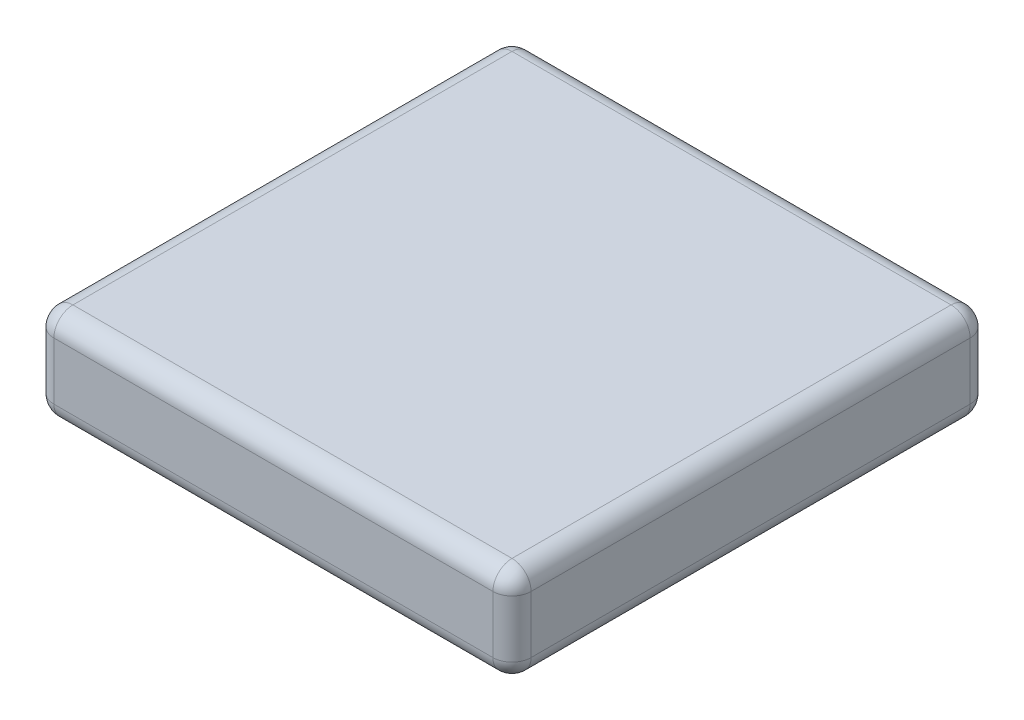
ISO-10303-21;
HEADER;
FILE_DESCRIPTION(('STEP AP214'),'2;1');
FILE_NAME('part.step','',(''),(''),'','','');
FILE_SCHEMA(('AUTOMOTIVE_DESIGN { 1 0 10303 214 1 1 1 1 }'));
ENDSEC;
DATA;
#1=APPLICATION_CONTEXT('core data for automotive mechanical design processes');
#2=APPLICATION_PROTOCOL_DEFINITION('international standard','automotive_design',2000,#1);
#3=PRODUCT_CONTEXT('',#1,'mechanical');
#4=PRODUCT('Part','Part','',(#3));
#5=PRODUCT_RELATED_PRODUCT_CATEGORY('part','',(#4));
#6=PRODUCT_DEFINITION_FORMATION('','',#4);
#7=PRODUCT_DEFINITION_CONTEXT('part definition',#1,'design');
#8=PRODUCT_DEFINITION('design','',#6,#7);
#9=PRODUCT_DEFINITION_SHAPE('','',#8);
#10=(LENGTH_UNIT() NAMED_UNIT(*) SI_UNIT(.MILLI.,.METRE.));
#11=(NAMED_UNIT(*) PLANE_ANGLE_UNIT() SI_UNIT($,.RADIAN.));
#12=(NAMED_UNIT(*) SI_UNIT($,.STERADIAN.) SOLID_ANGLE_UNIT());
#13=UNCERTAINTY_MEASURE_WITH_UNIT(LENGTH_MEASURE(1.E-05),#10,'distance_accuracy_value','');
#14=(GEOMETRIC_REPRESENTATION_CONTEXT(3) GLOBAL_UNCERTAINTY_ASSIGNED_CONTEXT((#13)) GLOBAL_UNIT_ASSIGNED_CONTEXT((#10,
#11,#12)) REPRESENTATION_CONTEXT('',''));
#15=CARTESIAN_POINT('',(0.,0.,0.));
#16=DIRECTION('',(0.,0.,1.));
#17=DIRECTION('',(1.,0.,0.));
#18=AXIS2_PLACEMENT_3D('',#15,#16,#17);
#19=CARTESIAN_POINT('',(-25.,10.,25.));
#20=DIRECTION('',(1.,0.,0.));
#21=DIRECTION('',(0.,0.,-1.));
#22=AXIS2_PLACEMENT_3D('',#19,#20,#21);
#23=PLANE('',#22);
#24=DIRECTION('',(0.,-1.,0.));
#25=VECTOR('',#24,1.);
#26=CARTESIAN_POINT('',(-25.,10.,-23.));
#27=LINE('',#26,#25);
#28=CARTESIAN_POINT('',(-25.,8.,-23.));
#29=VERTEX_POINT('',#28);
#30=CARTESIAN_POINT('',(-25.,2.,-23.));
#31=VERTEX_POINT('',#30);
#32=EDGE_CURVE('E192',#29,#31,#27,.T.);
#33=ORIENTED_EDGE('',*,*,#32,.T.);
#34=DIRECTION('',(0.,0.,1.));
#35=VECTOR('',#34,1.);
#36=CARTESIAN_POINT('',(-25.,2.,25.));
#37=LINE('',#36,#35);
#38=CARTESIAN_POINT('',(-25.,2.,23.));
#39=VERTEX_POINT('',#38);
#40=EDGE_CURVE('E11',#31,#39,#37,.T.);
#41=ORIENTED_EDGE('',*,*,#40,.T.);
#42=DIRECTION('',(0.,-1.,0.));
#43=VECTOR('',#42,1.);
#44=CARTESIAN_POINT('',(-25.,10.,23.));
#45=LINE('',#44,#43);
#46=CARTESIAN_POINT('',(-25.,8.,23.));
#47=VERTEX_POINT('',#46);
#48=EDGE_CURVE('E190',#39,#47,#45,.F.);
#49=ORIENTED_EDGE('',*,*,#48,.T.);
#50=DIRECTION('',(0.,0.,1.));
#51=VECTOR('',#50,1.);
#52=CARTESIAN_POINT('',(-25.,8.,-23.));
#53=LINE('',#52,#51);
#54=EDGE_CURVE('E182',#47,#29,#53,.F.);
#55=ORIENTED_EDGE('',*,*,#54,.T.);
#56=EDGE_LOOP('',(#33,#41,#49,#55));
#57=FACE_BOUND('',#56,.T.);
#58=ADVANCED_FACE('F39',(#57),#23,.F.);
#59=CARTESIAN_POINT('',(25.,10.,25.));
#60=DIRECTION('',(0.,0.,-1.));
#61=DIRECTION('',(-1.,0.,0.));
#62=AXIS2_PLACEMENT_3D('',#59,#60,#61);
#63=PLANE('',#62);
#64=DIRECTION('',(0.,-1.,0.));
#65=VECTOR('',#64,1.);
#66=CARTESIAN_POINT('',(-23.,10.,25.));
#67=LINE('',#66,#65);
#68=CARTESIAN_POINT('',(-23.,8.,25.));
#69=VERTEX_POINT('',#68);
#70=CARTESIAN_POINT('',(-23.,2.,25.));
#71=VERTEX_POINT('',#70);
#72=EDGE_CURVE('E198',#69,#71,#67,.T.);
#73=ORIENTED_EDGE('',*,*,#72,.T.);
#74=DIRECTION('',(1.,0.,0.));
#75=VECTOR('',#74,1.);
#76=CARTESIAN_POINT('',(25.,2.,25.));
#77=LINE('',#76,#75);
#78=CARTESIAN_POINT('',(23.,2.,25.));
#79=VERTEX_POINT('',#78);
#80=EDGE_CURVE('E234',#71,#79,#77,.T.);
#81=ORIENTED_EDGE('',*,*,#80,.T.);
#82=DIRECTION('',(0.,-1.,0.));
#83=VECTOR('',#82,1.);
#84=CARTESIAN_POINT('',(23.,10.,25.));
#85=LINE('',#84,#83);
#86=CARTESIAN_POINT('',(23.,8.,25.));
#87=VERTEX_POINT('',#86);
#88=EDGE_CURVE('E164',#79,#87,#85,.F.);
#89=ORIENTED_EDGE('',*,*,#88,.T.);
#90=DIRECTION('',(1.,0.,0.));
#91=VECTOR('',#90,1.);
#92=CARTESIAN_POINT('',(-25.,8.,25.));
#93=LINE('',#92,#91);
#94=EDGE_CURVE('E139',#87,#69,#93,.F.);
#95=ORIENTED_EDGE('',*,*,#94,.T.);
#96=EDGE_LOOP('',(#73,#81,#89,#95));
#97=FACE_BOUND('',#96,.T.);
#98=ADVANCED_FACE('F308',(#97),#63,.F.);
#99=CARTESIAN_POINT('',(25.,10.,25.));
#100=DIRECTION('',(-1.,0.,0.));
#101=DIRECTION('',(0.,0.,1.));
#102=AXIS2_PLACEMENT_3D('',#99,#100,#101);
#103=PLANE('',#102);
#104=DIRECTION('',(0.,-1.,0.));
#105=VECTOR('',#104,1.);
#106=CARTESIAN_POINT('',(25.,10.,23.));
#107=LINE('',#106,#105);
#108=CARTESIAN_POINT('',(25.,8.,23.));
#109=VERTEX_POINT('',#108);
#110=CARTESIAN_POINT('',(25.,2.,23.));
#111=VERTEX_POINT('',#110);
#112=EDGE_CURVE('E133',#109,#111,#107,.T.);
#113=ORIENTED_EDGE('',*,*,#112,.T.);
#114=DIRECTION('',(0.,0.,-1.));
#115=VECTOR('',#114,1.);
#116=CARTESIAN_POINT('',(25.,2.,25.));
#117=LINE('',#116,#115);
#118=CARTESIAN_POINT('',(25.,2.,-23.));
#119=VERTEX_POINT('',#118);
#120=EDGE_CURVE('E231',#111,#119,#117,.T.);
#121=ORIENTED_EDGE('',*,*,#120,.T.);
#122=DIRECTION('',(0.,-1.,0.));
#123=VECTOR('',#122,1.);
#124=CARTESIAN_POINT('',(25.,10.,-23.));
#125=LINE('',#124,#123);
#126=CARTESIAN_POINT('',(25.,8.,-23.));
#127=VERTEX_POINT('',#126);
#128=EDGE_CURVE('E136',#119,#127,#125,.F.);
#129=ORIENTED_EDGE('',*,*,#128,.T.);
#130=DIRECTION('',(0.,0.,-1.));
#131=VECTOR('',#130,1.);
#132=CARTESIAN_POINT('',(25.,8.,23.));
#133=LINE('',#132,#131);
#134=EDGE_CURVE('E129',#127,#109,#133,.F.);
#135=ORIENTED_EDGE('',*,*,#134,.T.);
#136=EDGE_LOOP('',(#113,#121,#129,#135));
#137=FACE_BOUND('',#136,.T.);
#138=ADVANCED_FACE('F131',(#137),#103,.F.);
#139=CARTESIAN_POINT('',(25.,10.,-25.));
#140=DIRECTION('',(0.,0.,1.));
#141=DIRECTION('',(1.,0.,0.));
#142=AXIS2_PLACEMENT_3D('',#139,#140,#141);
#143=PLANE('',#142);
#144=DIRECTION('',(0.,-1.,0.));
#145=VECTOR('',#144,1.);
#146=CARTESIAN_POINT('',(23.,10.,-25.));
#147=LINE('',#146,#145);
#148=CARTESIAN_POINT('',(23.,8.,-25.));
#149=VERTEX_POINT('',#148);
#150=CARTESIAN_POINT('',(23.,2.,-25.));
#151=VERTEX_POINT('',#150);
#152=EDGE_CURVE('E173',#149,#151,#147,.T.);
#153=ORIENTED_EDGE('',*,*,#152,.T.);
#154=DIRECTION('',(-1.,0.,0.));
#155=VECTOR('',#154,1.);
#156=CARTESIAN_POINT('',(25.,2.,-25.));
#157=LINE('',#156,#155);
#158=CARTESIAN_POINT('',(-23.,2.,-25.));
#159=VERTEX_POINT('',#158);
#160=EDGE_CURVE('E218',#151,#159,#157,.T.);
#161=ORIENTED_EDGE('',*,*,#160,.T.);
#162=DIRECTION('',(0.,-1.,0.));
#163=VECTOR('',#162,1.);
#164=CARTESIAN_POINT('',(-23.,10.,-25.));
#165=LINE('',#164,#163);
#166=CARTESIAN_POINT('',(-23.,8.,-25.));
#167=VERTEX_POINT('',#166);
#168=EDGE_CURVE('E194',#159,#167,#165,.F.);
#169=ORIENTED_EDGE('',*,*,#168,.T.);
#170=DIRECTION('',(-1.,0.,0.));
#171=VECTOR('',#170,1.);
#172=CARTESIAN_POINT('',(23.,8.,-25.));
#173=LINE('',#172,#171);
#174=EDGE_CURVE('E170',#167,#149,#173,.F.);
#175=ORIENTED_EDGE('',*,*,#174,.T.);
#176=EDGE_LOOP('',(#153,#161,#169,#175));
#177=FACE_BOUND('',#176,.T.);
#178=ADVANCED_FACE('F315',(#177),#143,.F.);
#179=CARTESIAN_POINT('',(0.,10.,0.));
#180=DIRECTION('',(0.,1.,0.));
#181=DIRECTION('',(0.,0.,1.));
#182=AXIS2_PLACEMENT_3D('',#179,#180,#181);
#183=PLANE('',#182);
#184=DIRECTION('',(-1.,0.,0.));
#185=VECTOR('',#184,1.);
#186=CARTESIAN_POINT('',(-25.,10.,-23.));
#187=LINE('',#186,#185);
#188=CARTESIAN_POINT('',(23.,10.,-23.));
#189=VERTEX_POINT('',#188);
#190=CARTESIAN_POINT('',(-23.,10.,-23.));
#191=VERTEX_POINT('',#190);
#192=EDGE_CURVE('E179',#189,#191,#187,.T.);
#193=ORIENTED_EDGE('',*,*,#192,.T.);
#194=DIRECTION('',(0.,0.,1.));
#195=VECTOR('',#194,1.);
#196=CARTESIAN_POINT('',(-23.,10.,23.));
#197=LINE('',#196,#195);
#198=CARTESIAN_POINT('',(-23.,10.,23.));
#199=VERTEX_POINT('',#198);
#200=EDGE_CURVE('E202',#191,#199,#197,.T.);
#201=ORIENTED_EDGE('',*,*,#200,.T.);
#202=DIRECTION('',(1.,0.,0.));
#203=VECTOR('',#202,1.);
#204=CARTESIAN_POINT('',(25.,10.,23.));
#205=LINE('',#204,#203);
#206=CARTESIAN_POINT('',(23.,10.,23.));
#207=VERTEX_POINT('',#206);
#208=EDGE_CURVE('E150',#199,#207,#205,.T.);
#209=ORIENTED_EDGE('',*,*,#208,.T.);
#210=DIRECTION('',(0.,0.,-1.));
#211=VECTOR('',#210,1.);
#212=CARTESIAN_POINT('',(23.,10.,-25.));
#213=LINE('',#212,#211);
#214=EDGE_CURVE('E147',#207,#189,#213,.T.);
#215=ORIENTED_EDGE('',*,*,#214,.T.);
#216=EDGE_LOOP('',(#193,#201,#209,#215));
#217=FACE_BOUND('',#216,.T.);
#218=ADVANCED_FACE('F277',(#217),#183,.T.);
#219=CARTESIAN_POINT('',(0.,0.,0.));
#220=DIRECTION('',(0.,1.,0.));
#221=DIRECTION('',(0.,0.,1.));
#222=AXIS2_PLACEMENT_3D('',#219,#220,#221);
#223=PLANE('',#222);
#224=DIRECTION('',(0.,0.,1.));
#225=VECTOR('',#224,1.);
#226=CARTESIAN_POINT('',(-23.,0.,0.));
#227=LINE('',#226,#225);
#228=CARTESIAN_POINT('',(-23.,0.,23.));
#229=VERTEX_POINT('',#228);
#230=CARTESIAN_POINT('',(-23.,0.,-23.));
#231=VERTEX_POINT('',#230);
#232=EDGE_CURVE('E220',#229,#231,#227,.F.);
#233=ORIENTED_EDGE('',*,*,#232,.T.);
#234=DIRECTION('',(-1.,0.,0.));
#235=VECTOR('',#234,1.);
#236=CARTESIAN_POINT('',(0.,0.,-23.));
#237=LINE('',#236,#235);
#238=CARTESIAN_POINT('',(23.,0.,-23.));
#239=VERTEX_POINT('',#238);
#240=EDGE_CURVE('E226',#231,#239,#237,.F.);
#241=ORIENTED_EDGE('',*,*,#240,.T.);
#242=DIRECTION('',(0.,0.,-1.));
#243=VECTOR('',#242,1.);
#244=CARTESIAN_POINT('',(23.,0.,0.));
#245=LINE('',#244,#243);
#246=CARTESIAN_POINT('',(23.,0.,23.));
#247=VERTEX_POINT('',#246);
#248=EDGE_CURVE('E224',#239,#247,#245,.F.);
#249=ORIENTED_EDGE('',*,*,#248,.T.);
#250=DIRECTION('',(1.,0.,0.));
#251=VECTOR('',#250,1.);
#252=CARTESIAN_POINT('',(0.,0.,23.));
#253=LINE('',#252,#251);
#254=EDGE_CURVE('E222',#247,#229,#253,.F.);
#255=ORIENTED_EDGE('',*,*,#254,.T.);
#256=EDGE_LOOP('',(#233,#241,#249,#255));
#257=FACE_BOUND('',#256,.T.);
#258=ADVANCED_FACE('F322',(#257),#223,.F.);
#259=CARTESIAN_POINT('',(0.,8.,23.));
#260=DIRECTION('',(-1.,0.,0.));
#261=DIRECTION('',(0.,0.,1.));
#262=AXIS2_PLACEMENT_3D('',#259,#260,#261);
#263=CYLINDRICAL_SURFACE('',#262,2.);
#264=ORIENTED_EDGE('',*,*,#208,.F.);
#265=CARTESIAN_POINT('',(-23.,8.,23.));
#266=DIRECTION('',(-1.,0.,0.));
#267=DIRECTION('',(0.,0.,1.));
#268=AXIS2_PLACEMENT_3D('',#265,#266,#267);
#269=CIRCLE('',#268,2.);
#270=EDGE_CURVE('E200',#199,#69,#269,.F.);
#271=ORIENTED_EDGE('',*,*,#270,.T.);
#272=ORIENTED_EDGE('',*,*,#94,.F.);
#273=CARTESIAN_POINT('',(23.,8.,23.));
#274=DIRECTION('',(-1.,0.,0.));
#275=DIRECTION('',(0.,0.,1.));
#276=AXIS2_PLACEMENT_3D('',#273,#274,#275);
#277=CIRCLE('',#276,2.);
#278=EDGE_CURVE('E156',#87,#207,#277,.T.);
#279=ORIENTED_EDGE('',*,*,#278,.T.);
#280=EDGE_LOOP('',(#264,#271,#272,#279));
#281=FACE_BOUND('',#280,.T.);
#282=ADVANCED_FACE('F300',(#281),#263,.T.);
#283=CARTESIAN_POINT('',(23.,8.,0.));
#284=DIRECTION('',(0.,0.,1.));
#285=DIRECTION('',(1.,0.,0.));
#286=AXIS2_PLACEMENT_3D('',#283,#284,#285);
#287=CYLINDRICAL_SURFACE('',#286,2.);
#288=ORIENTED_EDGE('',*,*,#134,.F.);
#289=CARTESIAN_POINT('',(23.,8.,-23.));
#290=DIRECTION('',(0.,0.,1.));
#291=DIRECTION('',(1.,0.,0.));
#292=AXIS2_PLACEMENT_3D('',#289,#290,#291);
#293=CIRCLE('',#292,2.);
#294=EDGE_CURVE('E177',#127,#189,#293,.T.);
#295=ORIENTED_EDGE('',*,*,#294,.T.);
#296=ORIENTED_EDGE('',*,*,#214,.F.);
#297=CARTESIAN_POINT('',(23.,8.,23.));
#298=DIRECTION('',(0.,0.,1.));
#299=DIRECTION('',(1.,0.,0.));
#300=AXIS2_PLACEMENT_3D('',#297,#298,#299);
#301=CIRCLE('',#300,2.);
#302=EDGE_CURVE('E143',#109,#207,#301,.T.);
#303=ORIENTED_EDGE('',*,*,#302,.F.);
#304=EDGE_LOOP('',(#288,#295,#296,#303));
#305=FACE_BOUND('',#304,.T.);
#306=ADVANCED_FACE('F145',(#305),#287,.T.);
#307=CARTESIAN_POINT('',(23.,8.,23.));
#308=DIRECTION('',(-1.,0.,0.));
#309=DIRECTION('',(0.,0.,1.));
#310=AXIS2_PLACEMENT_3D('',#307,#308,#309);
#311=SPHERICAL_SURFACE('',#310,2.);
#312=ORIENTED_EDGE('',*,*,#302,.T.);
#313=ORIENTED_EDGE('',*,*,#278,.F.);
#314=CARTESIAN_POINT('',(23.,8.,23.));
#315=DIRECTION('',(0.,-1.,0.));
#316=DIRECTION('',(0.,0.,-1.));
#317=AXIS2_PLACEMENT_3D('',#314,#315,#316);
#318=CIRCLE('',#317,2.);
#319=EDGE_CURVE('E151',#109,#87,#318,.T.);
#320=ORIENTED_EDGE('',*,*,#319,.F.);
#321=EDGE_LOOP('',(#312,#313,#320));
#322=FACE_BOUND('',#321,.T.);
#323=ADVANCED_FACE('F154',(#322),#311,.T.);
#324=CARTESIAN_POINT('',(23.,10.,23.));
#325=DIRECTION('',(0.,-1.,0.));
#326=DIRECTION('',(0.,0.,-1.));
#327=AXIS2_PLACEMENT_3D('',#324,#325,#326);
#328=CYLINDRICAL_SURFACE('',#327,2.);
#329=ORIENTED_EDGE('',*,*,#88,.F.);
#330=CARTESIAN_POINT('',(23.,2.,23.));
#331=DIRECTION('',(0.,-1.,0.));
#332=DIRECTION('',(0.,0.,-1.));
#333=AXIS2_PLACEMENT_3D('',#330,#331,#332);
#334=CIRCLE('',#333,2.);
#335=EDGE_CURVE('E163',#79,#111,#334,.F.);
#336=ORIENTED_EDGE('',*,*,#335,.T.);
#337=ORIENTED_EDGE('',*,*,#112,.F.);
#338=ORIENTED_EDGE('',*,*,#319,.T.);
#339=EDGE_LOOP('',(#329,#336,#337,#338));
#340=FACE_BOUND('',#339,.T.);
#341=ADVANCED_FACE('F161',(#340),#328,.T.);
#342=CARTESIAN_POINT('',(0.,8.,-23.));
#343=DIRECTION('',(1.,0.,0.));
#344=DIRECTION('',(0.,0.,-1.));
#345=AXIS2_PLACEMENT_3D('',#342,#343,#344);
#346=CYLINDRICAL_SURFACE('',#345,2.);
#347=ORIENTED_EDGE('',*,*,#174,.F.);
#348=CARTESIAN_POINT('',(-23.,8.,-23.));
#349=DIRECTION('',(1.,0.,0.));
#350=DIRECTION('',(0.,0.,-1.));
#351=AXIS2_PLACEMENT_3D('',#348,#349,#350);
#352=CIRCLE('',#351,2.);
#353=EDGE_CURVE('E196',#167,#191,#352,.T.);
#354=ORIENTED_EDGE('',*,*,#353,.T.);
#355=ORIENTED_EDGE('',*,*,#192,.F.);
#356=CARTESIAN_POINT('',(23.,8.,-23.));
#357=DIRECTION('',(1.,0.,0.));
#358=DIRECTION('',(0.,0.,-1.));
#359=AXIS2_PLACEMENT_3D('',#356,#357,#358);
#360=CIRCLE('',#359,2.);
#361=EDGE_CURVE('E159',#149,#189,#360,.T.);
#362=ORIENTED_EDGE('',*,*,#361,.F.);
#363=EDGE_LOOP('',(#347,#354,#355,#362));
#364=FACE_BOUND('',#363,.T.);
#365=ADVANCED_FACE('F282',(#364),#346,.T.);
#366=CARTESIAN_POINT('',(23.,8.,-23.));
#367=DIRECTION('',(0.,0.,1.));
#368=DIRECTION('',(1.,0.,0.));
#369=AXIS2_PLACEMENT_3D('',#366,#367,#368);
#370=SPHERICAL_SURFACE('',#369,2.);
#371=ORIENTED_EDGE('',*,*,#361,.T.);
#372=ORIENTED_EDGE('',*,*,#294,.F.);
#373=CARTESIAN_POINT('',(23.,8.,-23.));
#374=DIRECTION('',(0.,-1.,0.));
#375=DIRECTION('',(0.,0.,-1.));
#376=AXIS2_PLACEMENT_3D('',#373,#374,#375);
#377=CIRCLE('',#376,2.);
#378=EDGE_CURVE('E183',#149,#127,#377,.T.);
#379=ORIENTED_EDGE('',*,*,#378,.F.);
#380=EDGE_LOOP('',(#371,#372,#379));
#381=FACE_BOUND('',#380,.T.);
#382=ADVANCED_FACE('F273',(#381),#370,.T.);
#383=CARTESIAN_POINT('',(23.,10.,-23.));
#384=DIRECTION('',(0.,-1.,0.));
#385=DIRECTION('',(0.,0.,-1.));
#386=AXIS2_PLACEMENT_3D('',#383,#384,#385);
#387=CYLINDRICAL_SURFACE('',#386,2.);
#388=ORIENTED_EDGE('',*,*,#128,.F.);
#389=CARTESIAN_POINT('',(23.,2.,-23.));
#390=DIRECTION('',(0.,-1.,0.));
#391=DIRECTION('',(0.,0.,-1.));
#392=AXIS2_PLACEMENT_3D('',#389,#390,#391);
#393=CIRCLE('',#392,2.);
#394=EDGE_CURVE('E229',#119,#151,#393,.F.);
#395=ORIENTED_EDGE('',*,*,#394,.T.);
#396=ORIENTED_EDGE('',*,*,#152,.F.);
#397=ORIENTED_EDGE('',*,*,#378,.T.);
#398=EDGE_LOOP('',(#388,#395,#396,#397));
#399=FACE_BOUND('',#398,.T.);
#400=ADVANCED_FACE('F269',(#399),#387,.T.);
#401=CARTESIAN_POINT('',(-23.,10.,23.));
#402=DIRECTION('',(0.,-1.,0.));
#403=DIRECTION('',(0.,0.,-1.));
#404=AXIS2_PLACEMENT_3D('',#401,#402,#403);
#405=CYLINDRICAL_SURFACE('',#404,2.);
#406=ORIENTED_EDGE('',*,*,#48,.F.);
#407=CARTESIAN_POINT('',(-23.,2.,23.));
#408=DIRECTION('',(0.,-1.,0.));
#409=DIRECTION('',(0.,0.,-1.));
#410=AXIS2_PLACEMENT_3D('',#407,#408,#409);
#411=CIRCLE('',#410,2.);
#412=EDGE_CURVE('E48',#39,#71,#411,.F.);
#413=ORIENTED_EDGE('',*,*,#412,.T.);
#414=ORIENTED_EDGE('',*,*,#72,.F.);
#415=CARTESIAN_POINT('',(-23.,8.,23.));
#416=DIRECTION('',(0.,1.,0.));
#417=DIRECTION('',(0.,0.,1.));
#418=AXIS2_PLACEMENT_3D('',#415,#416,#417);
#419=CIRCLE('',#418,2.);
#420=EDGE_CURVE('E186',#47,#69,#419,.T.);
#421=ORIENTED_EDGE('',*,*,#420,.F.);
#422=EDGE_LOOP('',(#406,#413,#414,#421));
#423=FACE_BOUND('',#422,.T.);
#424=ADVANCED_FACE('F306',(#423),#405,.T.);
#425=CARTESIAN_POINT('',(-23.,8.,23.));
#426=DIRECTION('',(1.,0.,0.));
#427=DIRECTION('',(0.,0.,-1.));
#428=AXIS2_PLACEMENT_3D('',#425,#426,#427);
#429=SPHERICAL_SURFACE('',#428,2.);
#430=ORIENTED_EDGE('',*,*,#420,.T.);
#431=ORIENTED_EDGE('',*,*,#270,.F.);
#432=CARTESIAN_POINT('',(-23.,8.,23.));
#433=DIRECTION('',(0.,0.,-1.));
#434=DIRECTION('',(-1.,0.,0.));
#435=AXIS2_PLACEMENT_3D('',#432,#433,#434);
#436=CIRCLE('',#435,2.);
#437=EDGE_CURVE('E211',#47,#199,#436,.T.);
#438=ORIENTED_EDGE('',*,*,#437,.F.);
#439=EDGE_LOOP('',(#430,#431,#438));
#440=FACE_BOUND('',#439,.T.);
#441=ADVANCED_FACE('F305',(#440),#429,.T.);
#442=CARTESIAN_POINT('',(-23.,8.,0.));
#443=DIRECTION('',(0.,0.,-1.));
#444=DIRECTION('',(-1.,0.,0.));
#445=AXIS2_PLACEMENT_3D('',#442,#443,#444);
#446=CYLINDRICAL_SURFACE('',#445,2.);
#447=ORIENTED_EDGE('',*,*,#437,.T.);
#448=ORIENTED_EDGE('',*,*,#200,.F.);
#449=CARTESIAN_POINT('',(-23.,8.,-23.));
#450=DIRECTION('',(0.,0.,-1.));
#451=DIRECTION('',(-1.,0.,0.));
#452=AXIS2_PLACEMENT_3D('',#449,#450,#451);
#453=CIRCLE('',#452,2.);
#454=EDGE_CURVE('E208',#29,#191,#453,.T.);
#455=ORIENTED_EDGE('',*,*,#454,.F.);
#456=ORIENTED_EDGE('',*,*,#54,.F.);
#457=EDGE_LOOP('',(#447,#448,#455,#456));
#458=FACE_BOUND('',#457,.T.);
#459=ADVANCED_FACE('F296',(#458),#446,.T.);
#460=CARTESIAN_POINT('',(-23.,8.,-23.));
#461=DIRECTION('',(1.,0.,0.));
#462=DIRECTION('',(0.,0.,-1.));
#463=AXIS2_PLACEMENT_3D('',#460,#461,#462);
#464=SPHERICAL_SURFACE('',#463,2.);
#465=ORIENTED_EDGE('',*,*,#454,.T.);
#466=ORIENTED_EDGE('',*,*,#353,.F.);
#467=CARTESIAN_POINT('',(-23.,8.,-23.));
#468=DIRECTION('',(0.,-1.,0.));
#469=DIRECTION('',(0.,0.,-1.));
#470=AXIS2_PLACEMENT_3D('',#467,#468,#469);
#471=CIRCLE('',#470,2.);
#472=EDGE_CURVE('E205',#29,#167,#471,.T.);
#473=ORIENTED_EDGE('',*,*,#472,.F.);
#474=EDGE_LOOP('',(#465,#466,#473));
#475=FACE_BOUND('',#474,.T.);
#476=ADVANCED_FACE('F286',(#475),#464,.T.);
#477=CARTESIAN_POINT('',(-23.,10.,-23.));
#478=DIRECTION('',(0.,-1.,0.));
#479=DIRECTION('',(0.,0.,-1.));
#480=AXIS2_PLACEMENT_3D('',#477,#478,#479);
#481=CYLINDRICAL_SURFACE('',#480,2.);
#482=ORIENTED_EDGE('',*,*,#168,.F.);
#483=CARTESIAN_POINT('',(-23.,2.,-23.));
#484=DIRECTION('',(0.,-1.,0.));
#485=DIRECTION('',(0.,0.,-1.));
#486=AXIS2_PLACEMENT_3D('',#483,#484,#485);
#487=CIRCLE('',#486,2.);
#488=EDGE_CURVE('E204',#159,#31,#487,.F.);
#489=ORIENTED_EDGE('',*,*,#488,.T.);
#490=ORIENTED_EDGE('',*,*,#32,.F.);
#491=ORIENTED_EDGE('',*,*,#472,.T.);
#492=EDGE_LOOP('',(#482,#489,#490,#491));
#493=FACE_BOUND('',#492,.T.);
#494=ADVANCED_FACE('F291',(#493),#481,.T.);
#495=CARTESIAN_POINT('',(23.,2.,23.));
#496=DIRECTION('',(0.,1.,0.));
#497=DIRECTION('',(0.,0.,1.));
#498=AXIS2_PLACEMENT_3D('',#495,#496,#497);
#499=SPHERICAL_SURFACE('',#498,2.);
#500=CARTESIAN_POINT('',(23.,2.,23.));
#501=DIRECTION('',(0.,0.,-1.));
#502=DIRECTION('',(-1.,0.,0.));
#503=AXIS2_PLACEMENT_3D('',#500,#501,#502);
#504=CIRCLE('',#503,2.);
#505=EDGE_CURVE('E252',#111,#247,#504,.T.);
#506=ORIENTED_EDGE('',*,*,#505,.F.);
#507=ORIENTED_EDGE('',*,*,#335,.F.);
#508=CARTESIAN_POINT('',(23.,2.,23.));
#509=DIRECTION('',(-1.,0.,0.));
#510=DIRECTION('',(0.,0.,1.));
#511=AXIS2_PLACEMENT_3D('',#508,#509,#510);
#512=CIRCLE('',#511,2.);
#513=EDGE_CURVE('E43',#247,#79,#512,.T.);
#514=ORIENTED_EDGE('',*,*,#513,.F.);
#515=EDGE_LOOP('',(#506,#507,#514));
#516=FACE_BOUND('',#515,.T.);
#517=ADVANCED_FACE('F41',(#516),#499,.T.);
#518=CARTESIAN_POINT('',(25.,2.,23.));
#519=DIRECTION('',(1.,0.,0.));
#520=DIRECTION('',(0.,0.,-1.));
#521=AXIS2_PLACEMENT_3D('',#518,#519,#520);
#522=CYLINDRICAL_SURFACE('',#521,2.);
#523=ORIENTED_EDGE('',*,*,#513,.T.);
#524=ORIENTED_EDGE('',*,*,#80,.F.);
#525=CARTESIAN_POINT('',(-23.,2.,23.));
#526=DIRECTION('',(-1.,0.,0.));
#527=DIRECTION('',(0.,0.,1.));
#528=AXIS2_PLACEMENT_3D('',#525,#526,#527);
#529=CIRCLE('',#528,2.);
#530=EDGE_CURVE('E250',#229,#71,#529,.T.);
#531=ORIENTED_EDGE('',*,*,#530,.F.);
#532=ORIENTED_EDGE('',*,*,#254,.F.);
#533=EDGE_LOOP('',(#523,#524,#531,#532));
#534=FACE_BOUND('',#533,.T.);
#535=ADVANCED_FACE('F262',(#534),#522,.T.);
#536=CARTESIAN_POINT('',(23.,2.,25.));
#537=DIRECTION('',(0.,0.,-1.));
#538=DIRECTION('',(-1.,0.,0.));
#539=AXIS2_PLACEMENT_3D('',#536,#537,#538);
#540=CYLINDRICAL_SURFACE('',#539,2.);
#541=ORIENTED_EDGE('',*,*,#505,.T.);
#542=ORIENTED_EDGE('',*,*,#248,.F.);
#543=CARTESIAN_POINT('',(23.,2.,-23.));
#544=DIRECTION('',(0.,0.,-1.));
#545=DIRECTION('',(-1.,0.,0.));
#546=AXIS2_PLACEMENT_3D('',#543,#544,#545);
#547=CIRCLE('',#546,2.);
#548=EDGE_CURVE('E247',#119,#239,#547,.T.);
#549=ORIENTED_EDGE('',*,*,#548,.F.);
#550=ORIENTED_EDGE('',*,*,#120,.F.);
#551=EDGE_LOOP('',(#541,#542,#549,#550));
#552=FACE_BOUND('',#551,.T.);
#553=ADVANCED_FACE('F266',(#552),#540,.T.);
#554=CARTESIAN_POINT('',(-23.,2.,23.));
#555=DIRECTION('',(0.,1.,0.));
#556=DIRECTION('',(0.,0.,1.));
#557=AXIS2_PLACEMENT_3D('',#554,#555,#556);
#558=SPHERICAL_SURFACE('',#557,2.);
#559=ORIENTED_EDGE('',*,*,#530,.T.);
#560=ORIENTED_EDGE('',*,*,#412,.F.);
#561=CARTESIAN_POINT('',(-23.,2.,23.));
#562=DIRECTION('',(0.,0.,-1.));
#563=DIRECTION('',(-1.,0.,0.));
#564=AXIS2_PLACEMENT_3D('',#561,#562,#563);
#565=CIRCLE('',#564,2.);
#566=EDGE_CURVE('E244',#229,#39,#565,.T.);
#567=ORIENTED_EDGE('',*,*,#566,.F.);
#568=EDGE_LOOP('',(#559,#560,#567));
#569=FACE_BOUND('',#568,.T.);
#570=ADVANCED_FACE('F360',(#569),#558,.T.);
#571=CARTESIAN_POINT('',(23.,2.,-23.));
#572=DIRECTION('',(0.,1.,0.));
#573=DIRECTION('',(0.,0.,1.));
#574=AXIS2_PLACEMENT_3D('',#571,#572,#573);
#575=SPHERICAL_SURFACE('',#574,2.);
#576=ORIENTED_EDGE('',*,*,#394,.F.);
#577=ORIENTED_EDGE('',*,*,#548,.T.);
#578=CARTESIAN_POINT('',(23.,2.,-23.));
#579=DIRECTION('',(-1.,0.,0.));
#580=DIRECTION('',(0.,0.,1.));
#581=AXIS2_PLACEMENT_3D('',#578,#579,#580);
#582=CIRCLE('',#581,2.);
#583=EDGE_CURVE('E242',#151,#239,#582,.T.);
#584=ORIENTED_EDGE('',*,*,#583,.F.);
#585=EDGE_LOOP('',(#576,#577,#584));
#586=FACE_BOUND('',#585,.T.);
#587=ADVANCED_FACE('F356',(#586),#575,.T.);
#588=CARTESIAN_POINT('',(-23.,2.,25.));
#589=DIRECTION('',(0.,0.,1.));
#590=DIRECTION('',(1.,0.,0.));
#591=AXIS2_PLACEMENT_3D('',#588,#589,#590);
#592=CYLINDRICAL_SURFACE('',#591,2.);
#593=ORIENTED_EDGE('',*,*,#566,.T.);
#594=ORIENTED_EDGE('',*,*,#40,.F.);
#595=CARTESIAN_POINT('',(-23.,2.,-23.));
#596=DIRECTION('',(0.,0.,-1.));
#597=DIRECTION('',(-1.,0.,0.));
#598=AXIS2_PLACEMENT_3D('',#595,#596,#597);
#599=CIRCLE('',#598,2.);
#600=EDGE_CURVE('E240',#231,#31,#599,.T.);
#601=ORIENTED_EDGE('',*,*,#600,.F.);
#602=ORIENTED_EDGE('',*,*,#232,.F.);
#603=EDGE_LOOP('',(#593,#594,#601,#602));
#604=FACE_BOUND('',#603,.T.);
#605=ADVANCED_FACE('F352',(#604),#592,.T.);
#606=CARTESIAN_POINT('',(25.,2.,-23.));
#607=DIRECTION('',(-1.,0.,0.));
#608=DIRECTION('',(0.,0.,1.));
#609=AXIS2_PLACEMENT_3D('',#606,#607,#608);
#610=CYLINDRICAL_SURFACE('',#609,2.);
#611=ORIENTED_EDGE('',*,*,#583,.T.);
#612=ORIENTED_EDGE('',*,*,#240,.F.);
#613=CARTESIAN_POINT('',(-23.,2.,-23.));
#614=DIRECTION('',(-1.,0.,0.));
#615=DIRECTION('',(0.,-1.,0.));
#616=AXIS2_PLACEMENT_3D('',#613,#614,#615);
#617=CIRCLE('',#616,2.);
#618=EDGE_CURVE('E237',#159,#231,#617,.T.);
#619=ORIENTED_EDGE('',*,*,#618,.F.);
#620=ORIENTED_EDGE('',*,*,#160,.F.);
#621=EDGE_LOOP('',(#611,#612,#619,#620));
#622=FACE_BOUND('',#621,.T.);
#623=ADVANCED_FACE('F348',(#622),#610,.T.);
#624=CARTESIAN_POINT('',(-23.,2.,-23.));
#625=DIRECTION('',(0.,1.,0.));
#626=DIRECTION('',(0.,0.,1.));
#627=AXIS2_PLACEMENT_3D('',#624,#625,#626);
#628=SPHERICAL_SURFACE('',#627,2.);
#629=ORIENTED_EDGE('',*,*,#600,.T.);
#630=ORIENTED_EDGE('',*,*,#488,.F.);
#631=ORIENTED_EDGE('',*,*,#618,.T.);
#632=EDGE_LOOP('',(#629,#630,#631));
#633=FACE_BOUND('',#632,.T.);
#634=ADVANCED_FACE('F345',(#633),#628,.T.);
#635=CLOSED_SHELL('',(#58,#98,#138,#178,#218,#258,#282,#306,#323,#341,#365,#382,#400,#424,#441,
#459,#476,#494,#517,#535,#553,#570,#587,#605,#623,#634));
#636=MANIFOLD_SOLID_BREP('B2',#635);
#637=ADVANCED_BREP_SHAPE_REPRESENTATION('',(#18,#636),#14);
#638=SHAPE_DEFINITION_REPRESENTATION(#9,#637);
ENDSEC;
END-ISO-10303-21;
